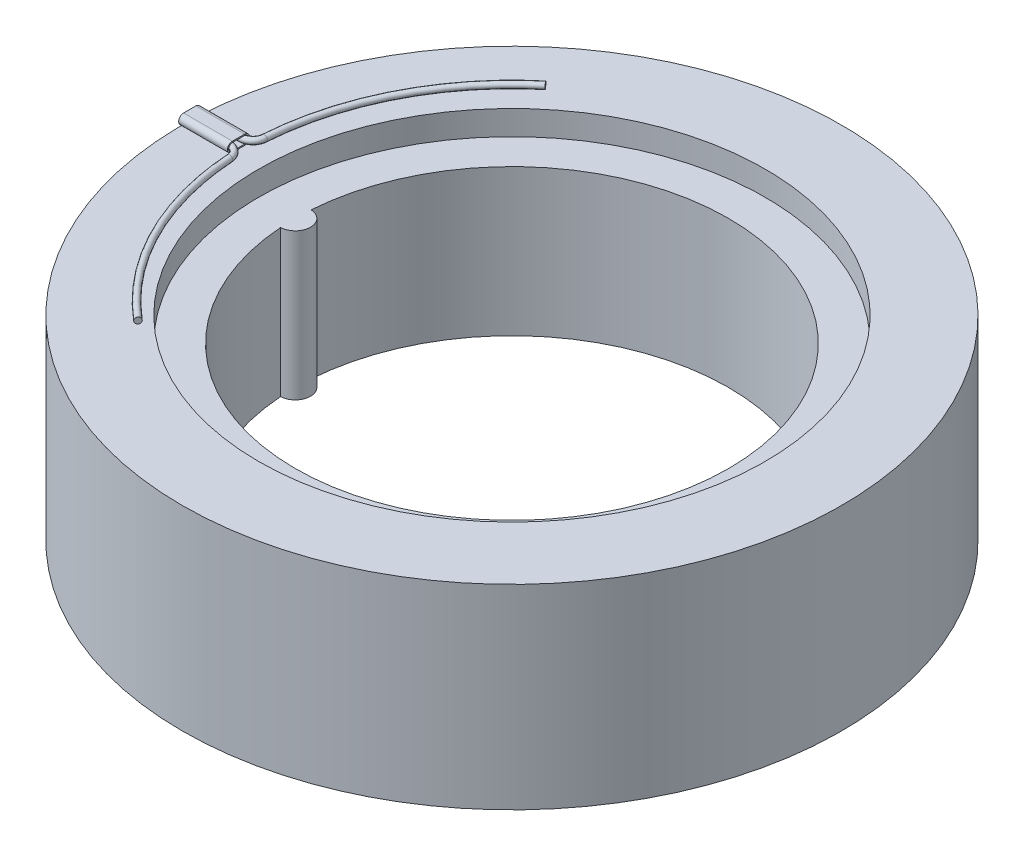
ISO-10303-21;
HEADER;
FILE_DESCRIPTION(('STEP AP214'),'2;1');
FILE_NAME('part.step','',(''),(''),'','','');
FILE_SCHEMA(('AUTOMOTIVE_DESIGN { 1 0 10303 214 1 1 1 1 }'));
ENDSEC;
DATA;
#1=APPLICATION_CONTEXT('core data for automotive mechanical design processes');
#2=APPLICATION_PROTOCOL_DEFINITION('international standard','automotive_design',2000,#1);
#3=PRODUCT_CONTEXT('',#1,'mechanical');
#4=PRODUCT('Part','Part','',(#3));
#5=PRODUCT_RELATED_PRODUCT_CATEGORY('part','',(#4));
#6=PRODUCT_DEFINITION_FORMATION('','',#4);
#7=PRODUCT_DEFINITION_CONTEXT('part definition',#1,'design');
#8=PRODUCT_DEFINITION('design','',#6,#7);
#9=PRODUCT_DEFINITION_SHAPE('','',#8);
#10=(LENGTH_UNIT() NAMED_UNIT(*) SI_UNIT(.MILLI.,.METRE.));
#11=(NAMED_UNIT(*) PLANE_ANGLE_UNIT() SI_UNIT($,.RADIAN.));
#12=(NAMED_UNIT(*) SI_UNIT($,.STERADIAN.) SOLID_ANGLE_UNIT());
#13=UNCERTAINTY_MEASURE_WITH_UNIT(LENGTH_MEASURE(1.E-05),#10,'distance_accuracy_value','');
#14=(GEOMETRIC_REPRESENTATION_CONTEXT(3) GLOBAL_UNCERTAINTY_ASSIGNED_CONTEXT((#13)) GLOBAL_UNIT_ASSIGNED_CONTEXT((#10,
#11,#12)) REPRESENTATION_CONTEXT('',''));
#15=CARTESIAN_POINT('',(0.,0.,0.));
#16=DIRECTION('',(0.,0.,1.));
#17=DIRECTION('',(1.,0.,0.));
#18=AXIS2_PLACEMENT_3D('',#15,#16,#17);
#19=CARTESIAN_POINT('',(-26.4,9.,-0.499999999999997));
#20=DIRECTION('',(1.,0.,0.));
#21=DIRECTION('',(0.,0.,-1.));
#22=AXIS2_PLACEMENT_3D('',#19,#20,#21);
#23=CYLINDRICAL_SURFACE('',#22,0.403274161944219);
#24=CARTESIAN_POINT('',(-22.4,9.,-0.499999999999997));
#25=DIRECTION('',(1.,0.,0.));
#26=DIRECTION('',(0.,0.,-1.));
#27=AXIS2_PLACEMENT_3D('',#24,#25,#26);
#28=CIRCLE('',#27,0.403274161944219);
#29=CARTESIAN_POINT('',(-22.4,8.59672583805578,-0.499999999999997));
#30=VERTEX_POINT('',#29);
#31=CARTESIAN_POINT('',(-22.4,9.40327416194422,-0.499999999999997));
#32=VERTEX_POINT('',#31);
#33=EDGE_CURVE('E180',#30,#32,#28,.T.);
#34=ORIENTED_EDGE('',*,*,#33,.F.);
#35=DIRECTION('',(1.,0.,0.));
#36=VECTOR('',#35,1.);
#37=CARTESIAN_POINT('',(-26.4,8.59672583805578,-0.499999999999997));
#38=LINE('',#37,#36);
#39=CARTESIAN_POINT('',(-26.4,8.59672583805578,-0.499999999999997));
#40=VERTEX_POINT('',#39);
#41=EDGE_CURVE('E13',#40,#30,#38,.T.);
#42=ORIENTED_EDGE('',*,*,#41,.F.);
#43=CARTESIAN_POINT('',(-26.4,9.,-0.499999999999997));
#44=DIRECTION('',(1.,0.,0.));
#45=DIRECTION('',(0.,0.,-1.));
#46=AXIS2_PLACEMENT_3D('',#43,#44,#45);
#47=CIRCLE('',#46,0.403274161944219);
#48=CARTESIAN_POINT('',(-26.4,9.40327416194422,-0.499999999999997));
#49=VERTEX_POINT('',#48);
#50=EDGE_CURVE('E184',#40,#49,#47,.T.);
#51=ORIENTED_EDGE('',*,*,#50,.T.);
#52=DIRECTION('',(1.,0.,0.));
#53=VECTOR('',#52,1.);
#54=CARTESIAN_POINT('',(-26.4,9.40327416194422,-0.499999999999997));
#55=LINE('',#54,#53);
#56=EDGE_CURVE('E85',#49,#32,#55,.T.);
#57=ORIENTED_EDGE('',*,*,#56,.T.);
#58=EDGE_LOOP('',(#34,#42,#51,#57));
#59=FACE_BOUND('',#58,.T.);
#60=ADVANCED_FACE('F82',(#59),#23,.T.);
#61=CARTESIAN_POINT('',(-26.4,8.59672583805578,-0.499999999999997));
#62=DIRECTION('',(0.,-1.,0.));
#63=DIRECTION('',(0.,0.,-1.));
#64=AXIS2_PLACEMENT_3D('',#61,#62,#63);
#65=PLANE('',#64);
#66=DIRECTION('',(0.,0.,-1.));
#67=VECTOR('',#66,1.);
#68=CARTESIAN_POINT('',(-22.4,8.59672583805578,-0.499999999999997));
#69=LINE('',#68,#67);
#70=CARTESIAN_POINT('',(-22.4,8.59672583805578,0.499999999999997));
#71=VERTEX_POINT('',#70);
#72=EDGE_CURVE('E188',#71,#30,#69,.T.);
#73=ORIENTED_EDGE('',*,*,#72,.F.);
#74=DIRECTION('',(1.,0.,0.));
#75=VECTOR('',#74,1.);
#76=CARTESIAN_POINT('',(-26.4,8.59672583805578,0.499999999999997));
#77=LINE('',#76,#75);
#78=CARTESIAN_POINT('',(-26.4,8.59672583805578,0.499999999999997));
#79=VERTEX_POINT('',#78);
#80=EDGE_CURVE('E90',#79,#71,#77,.T.);
#81=ORIENTED_EDGE('',*,*,#80,.F.);
#82=DIRECTION('',(0.,0.,-1.));
#83=VECTOR('',#82,1.);
#84=CARTESIAN_POINT('',(-26.4,8.59672583805578,-0.499999999999997));
#85=LINE('',#84,#83);
#86=EDGE_CURVE('E194',#79,#40,#85,.T.);
#87=ORIENTED_EDGE('',*,*,#86,.T.);
#88=ORIENTED_EDGE('',*,*,#41,.T.);
#89=EDGE_LOOP('',(#73,#81,#87,#88));
#90=FACE_BOUND('',#89,.T.);
#91=ADVANCED_FACE('F220',(#90),#65,.T.);
#92=CARTESIAN_POINT('',(-26.4,9.,0.499999999999997));
#93=DIRECTION('',(1.,0.,0.));
#94=DIRECTION('',(0.,0.,-1.));
#95=AXIS2_PLACEMENT_3D('',#92,#93,#94);
#96=CYLINDRICAL_SURFACE('',#95,0.403274161944219);
#97=CARTESIAN_POINT('',(-22.4,9.,0.499999999999997));
#98=DIRECTION('',(1.,0.,0.));
#99=DIRECTION('',(0.,0.,-1.));
#100=AXIS2_PLACEMENT_3D('',#97,#98,#99);
#101=CIRCLE('',#100,0.403274161944219);
#102=CARTESIAN_POINT('',(-22.4,9.40327416194422,0.499999999999997));
#103=VERTEX_POINT('',#102);
#104=EDGE_CURVE('E202',#103,#71,#101,.T.);
#105=ORIENTED_EDGE('',*,*,#104,.F.);
#106=DIRECTION('',(1.,0.,0.));
#107=VECTOR('',#106,1.);
#108=CARTESIAN_POINT('',(-26.4,9.40327416194422,0.499999999999997));
#109=LINE('',#108,#107);
#110=CARTESIAN_POINT('',(-26.4,9.40327416194422,0.499999999999997));
#111=VERTEX_POINT('',#110);
#112=EDGE_CURVE('E207',#111,#103,#109,.T.);
#113=ORIENTED_EDGE('',*,*,#112,.F.);
#114=CARTESIAN_POINT('',(-26.4,9.,0.499999999999997));
#115=DIRECTION('',(1.,0.,0.));
#116=DIRECTION('',(0.,0.,-1.));
#117=AXIS2_PLACEMENT_3D('',#114,#115,#116);
#118=CIRCLE('',#117,0.403274161944219);
#119=EDGE_CURVE('E191',#111,#79,#118,.T.);
#120=ORIENTED_EDGE('',*,*,#119,.T.);
#121=ORIENTED_EDGE('',*,*,#80,.T.);
#122=EDGE_LOOP('',(#105,#113,#120,#121));
#123=FACE_BOUND('',#122,.T.);
#124=ADVANCED_FACE('F224',(#123),#96,.T.);
#125=CARTESIAN_POINT('',(-26.4,9.40327416194422,-0.499999999999997));
#126=DIRECTION('',(0.,1.,0.));
#127=DIRECTION('',(0.,0.,1.));
#128=AXIS2_PLACEMENT_3D('',#125,#126,#127);
#129=PLANE('',#128);
#130=DIRECTION('',(0.,0.,1.));
#131=VECTOR('',#130,1.);
#132=CARTESIAN_POINT('',(-22.4,9.40327416194422,-0.499999999999997));
#133=LINE('',#132,#131);
#134=EDGE_CURVE('E199',#32,#103,#133,.T.);
#135=ORIENTED_EDGE('',*,*,#134,.F.);
#136=ORIENTED_EDGE('',*,*,#56,.F.);
#137=DIRECTION('',(0.,0.,1.));
#138=VECTOR('',#137,1.);
#139=CARTESIAN_POINT('',(-26.4,9.40327416194422,-0.499999999999997));
#140=LINE('',#139,#138);
#141=EDGE_CURVE('E187',#49,#111,#140,.T.);
#142=ORIENTED_EDGE('',*,*,#141,.T.);
#143=ORIENTED_EDGE('',*,*,#112,.T.);
#144=EDGE_LOOP('',(#135,#136,#142,#143));
#145=FACE_BOUND('',#144,.T.);
#146=ADVANCED_FACE('F215',(#145),#129,.T.);
#147=CARTESIAN_POINT('',(-26.4,9.,-0.499999999999997));
#148=DIRECTION('',(1.,0.,0.));
#149=DIRECTION('',(0.,0.,-1.));
#150=AXIS2_PLACEMENT_3D('',#147,#148,#149);
#151=PLANE('',#150);
#152=DIRECTION('',(0.,0.,-1.));
#153=VECTOR('',#152,1.);
#154=CARTESIAN_POINT('',(-26.4,8.69672583805578,-0.499999999999997));
#155=LINE('',#154,#153);
#156=CARTESIAN_POINT('',(-26.4,8.69672583805578,0.499999999999997));
#157=VERTEX_POINT('',#156);
#158=CARTESIAN_POINT('',(-26.4,8.69672583805578,-0.499999999999997));
#159=VERTEX_POINT('',#158);
#160=EDGE_CURVE('E155',#157,#159,#155,.T.);
#161=ORIENTED_EDGE('',*,*,#160,.T.);
#162=CARTESIAN_POINT('',(-26.4,9.,-0.499999999999997));
#163=DIRECTION('',(1.,0.,0.));
#164=DIRECTION('',(0.,0.,-1.));
#165=AXIS2_PLACEMENT_3D('',#162,#163,#164);
#166=CIRCLE('',#165,0.303274161944219);
#167=CARTESIAN_POINT('',(-26.4,9.30327416194422,-0.499999999999997));
#168=VERTEX_POINT('',#167);
#169=EDGE_CURVE('E149',#159,#168,#166,.T.);
#170=ORIENTED_EDGE('',*,*,#169,.T.);
#171=DIRECTION('',(0.,0.,1.));
#172=VECTOR('',#171,1.);
#173=CARTESIAN_POINT('',(-26.4,9.30327416194422,-0.499999999999997));
#174=LINE('',#173,#172);
#175=CARTESIAN_POINT('',(-26.4,9.30327416194422,0.499999999999997));
#176=VERTEX_POINT('',#175);
#177=EDGE_CURVE('E158',#168,#176,#174,.T.);
#178=ORIENTED_EDGE('',*,*,#177,.T.);
#179=CARTESIAN_POINT('',(-26.4,9.,0.499999999999997));
#180=DIRECTION('',(1.,0.,0.));
#181=DIRECTION('',(0.,0.,-1.));
#182=AXIS2_PLACEMENT_3D('',#179,#180,#181);
#183=CIRCLE('',#182,0.303274161944219);
#184=EDGE_CURVE('E98',#176,#157,#183,.T.);
#185=ORIENTED_EDGE('',*,*,#184,.T.);
#186=EDGE_LOOP('',(#161,#170,#178,#185));
#187=FACE_BOUND('',#186,.T.);
#188=ORIENTED_EDGE('',*,*,#50,.F.);
#189=ORIENTED_EDGE('',*,*,#86,.F.);
#190=ORIENTED_EDGE('',*,*,#119,.F.);
#191=ORIENTED_EDGE('',*,*,#141,.F.);
#192=EDGE_LOOP('',(#188,#189,#190,#191));
#193=FACE_BOUND('',#192,.T.);
#194=ADVANCED_FACE('F162',(#187,#193),#151,.F.);
#195=CARTESIAN_POINT('',(-22.4,9.,-0.499999999999997));
#196=DIRECTION('',(1.,0.,0.));
#197=DIRECTION('',(0.,0.,-1.));
#198=AXIS2_PLACEMENT_3D('',#195,#196,#197);
#199=PLANE('',#198);
#200=CARTESIAN_POINT('',(-22.4,9.,-0.499999999999997));
#201=DIRECTION('',(1.,0.,0.));
#202=DIRECTION('',(0.,0.,-1.));
#203=AXIS2_PLACEMENT_3D('',#200,#201,#202);
#204=CIRCLE('',#203,0.303274161944219);
#205=CARTESIAN_POINT('',(-22.4,8.69672583805578,-0.499999999999997));
#206=VERTEX_POINT('',#205);
#207=CARTESIAN_POINT('',(-22.4,9.30327416194422,-0.499999999999997));
#208=VERTEX_POINT('',#207);
#209=EDGE_CURVE('E106',#206,#208,#204,.T.);
#210=ORIENTED_EDGE('',*,*,#209,.F.);
#211=DIRECTION('',(0.,0.,-1.));
#212=VECTOR('',#211,1.);
#213=CARTESIAN_POINT('',(-22.4,8.69672583805578,-0.499999999999997));
#214=LINE('',#213,#212);
#215=CARTESIAN_POINT('',(-22.4,8.69672583805578,0.499999999999997));
#216=VERTEX_POINT('',#215);
#217=EDGE_CURVE('E165',#216,#206,#214,.T.);
#218=ORIENTED_EDGE('',*,*,#217,.F.);
#219=CARTESIAN_POINT('',(-22.4,9.,0.499999999999997));
#220=DIRECTION('',(1.,0.,0.));
#221=DIRECTION('',(0.,0.,-1.));
#222=AXIS2_PLACEMENT_3D('',#219,#220,#221);
#223=CIRCLE('',#222,0.303274161944219);
#224=CARTESIAN_POINT('',(-22.4,9.30327416194422,0.499999999999997));
#225=VERTEX_POINT('',#224);
#226=EDGE_CURVE('E168',#225,#216,#223,.T.);
#227=ORIENTED_EDGE('',*,*,#226,.F.);
#228=DIRECTION('',(0.,0.,1.));
#229=VECTOR('',#228,1.);
#230=CARTESIAN_POINT('',(-22.4,9.30327416194422,-0.499999999999997));
#231=LINE('',#230,#229);
#232=EDGE_CURVE('E174',#208,#225,#231,.T.);
#233=ORIENTED_EDGE('',*,*,#232,.F.);
#234=EDGE_LOOP('',(#210,#218,#227,#233));
#235=FACE_BOUND('',#234,.T.);
#236=ORIENTED_EDGE('',*,*,#33,.T.);
#237=ORIENTED_EDGE('',*,*,#134,.T.);
#238=ORIENTED_EDGE('',*,*,#104,.T.);
#239=ORIENTED_EDGE('',*,*,#72,.T.);
#240=EDGE_LOOP('',(#236,#237,#238,#239));
#241=FACE_BOUND('',#240,.T.);
#242=ADVANCED_FACE('F217',(#235,#241),#199,.T.);
#243=CARTESIAN_POINT('',(-26.4,9.,-0.499999999999997));
#244=DIRECTION('',(1.,0.,0.));
#245=DIRECTION('',(0.,0.,-1.));
#246=AXIS2_PLACEMENT_3D('',#243,#244,#245);
#247=CYLINDRICAL_SURFACE('',#246,0.303274161944219);
#248=ORIENTED_EDGE('',*,*,#209,.T.);
#249=DIRECTION('',(1.,0.,0.));
#250=VECTOR('',#249,1.);
#251=CARTESIAN_POINT('',(-26.4,9.30327416194422,-0.499999999999997));
#252=LINE('',#251,#250);
#253=EDGE_CURVE('E145',#168,#208,#252,.T.);
#254=ORIENTED_EDGE('',*,*,#253,.F.);
#255=ORIENTED_EDGE('',*,*,#169,.F.);
#256=DIRECTION('',(1.,0.,0.));
#257=VECTOR('',#256,1.);
#258=CARTESIAN_POINT('',(-26.4,8.69672583805578,-0.499999999999997));
#259=LINE('',#258,#257);
#260=EDGE_CURVE('E178',#159,#206,#259,.T.);
#261=ORIENTED_EDGE('',*,*,#260,.T.);
#262=EDGE_LOOP('',(#248,#254,#255,#261));
#263=FACE_BOUND('',#262,.T.);
#264=ADVANCED_FACE('F147',(#263),#247,.F.);
#265=CARTESIAN_POINT('',(-26.4,8.69672583805578,-0.499999999999997));
#266=DIRECTION('',(0.,-1.,0.));
#267=DIRECTION('',(0.,0.,-1.));
#268=AXIS2_PLACEMENT_3D('',#265,#266,#267);
#269=PLANE('',#268);
#270=ORIENTED_EDGE('',*,*,#217,.T.);
#271=ORIENTED_EDGE('',*,*,#260,.F.);
#272=ORIENTED_EDGE('',*,*,#160,.F.);
#273=DIRECTION('',(1.,0.,0.));
#274=VECTOR('',#273,1.);
#275=CARTESIAN_POINT('',(-26.4,8.69672583805578,0.499999999999997));
#276=LINE('',#275,#274);
#277=EDGE_CURVE('E181',#157,#216,#276,.T.);
#278=ORIENTED_EDGE('',*,*,#277,.T.);
#279=EDGE_LOOP('',(#270,#271,#272,#278));
#280=FACE_BOUND('',#279,.T.);
#281=ADVANCED_FACE('F275',(#280),#269,.F.);
#282=CARTESIAN_POINT('',(-26.4,9.,0.499999999999997));
#283=DIRECTION('',(1.,0.,0.));
#284=DIRECTION('',(0.,0.,-1.));
#285=AXIS2_PLACEMENT_3D('',#282,#283,#284);
#286=CYLINDRICAL_SURFACE('',#285,0.303274161944219);
#287=ORIENTED_EDGE('',*,*,#226,.T.);
#288=ORIENTED_EDGE('',*,*,#277,.F.);
#289=ORIENTED_EDGE('',*,*,#184,.F.);
#290=DIRECTION('',(1.,0.,0.));
#291=VECTOR('',#290,1.);
#292=CARTESIAN_POINT('',(-26.4,9.30327416194422,0.499999999999997));
#293=LINE('',#292,#291);
#294=EDGE_CURVE('E154',#176,#225,#293,.T.);
#295=ORIENTED_EDGE('',*,*,#294,.T.);
#296=EDGE_LOOP('',(#287,#288,#289,#295));
#297=FACE_BOUND('',#296,.T.);
#298=ADVANCED_FACE('F284',(#297),#286,.F.);
#299=CARTESIAN_POINT('',(-26.4,9.30327416194422,-0.499999999999997));
#300=DIRECTION('',(0.,1.,0.));
#301=DIRECTION('',(0.,0.,1.));
#302=AXIS2_PLACEMENT_3D('',#299,#300,#301);
#303=PLANE('',#302);
#304=ORIENTED_EDGE('',*,*,#232,.T.);
#305=ORIENTED_EDGE('',*,*,#294,.F.);
#306=ORIENTED_EDGE('',*,*,#177,.F.);
#307=ORIENTED_EDGE('',*,*,#253,.T.);
#308=EDGE_LOOP('',(#304,#305,#306,#307));
#309=FACE_BOUND('',#308,.T.);
#310=ADVANCED_FACE('F159',(#309),#303,.F.);
#311=CLOSED_SHELL('',(#60,#91,#124,#146,#194,#242,#264,#281,#298,#310));
#312=MANIFOLD_SOLID_BREP('B2',#311);
#313=CARTESIAN_POINT('',(-25.807382336069,9.,0.499999999999997));
#314=DIRECTION('',(-1.,0.,0.));
#315=DIRECTION('',(0.,0.,-1.));
#316=AXIS2_PLACEMENT_3D('',#313,#314,#315);
#317=PLANE('',#316);
#318=CARTESIAN_POINT('',(-25.807382336069,9.,0.499999999999997));
#319=DIRECTION('',(1.,0.,0.));
#320=DIRECTION('',(0.,0.,-1.));
#321=AXIS2_PLACEMENT_3D('',#318,#319,#320);
#322=CIRCLE('',#321,0.25);
#323=CARTESIAN_POINT('',(-25.807382336069,9.,0.249999999999997));
#324=VERTEX_POINT('',#323);
#325=EDGE_CURVE('E334',#324,#324,#322,.T.);
#326=ORIENTED_EDGE('',*,*,#325,.F.);
#327=EDGE_LOOP('',(#326));
#328=FACE_BOUND('',#327,.T.);
#329=ADVANCED_FACE('F322',(#328),#317,.T.);
#330=CARTESIAN_POINT('',(-13.9458880000921,9.,16.6905574469185));
#331=DIRECTION('',(-0.767381951582461,0.,-0.641190252877797));
#332=DIRECTION('',(0.641190252877797,0.,-0.767381951582461));
#333=AXIS2_PLACEMENT_3D('',#330,#331,#332);
#334=PLANE('',#333);
#335=CARTESIAN_POINT('',(-13.9458880000921,9.,16.6905574469185));
#336=DIRECTION('',(0.767381951582461,0.,0.641190252877797));
#337=DIRECTION('',(0.641190252877797,0.,-0.767381951582461));
#338=AXIS2_PLACEMENT_3D('',#335,#336,#337);
#339=CIRCLE('',#338,0.25);
#340=CARTESIAN_POINT('',(-13.7855904368726,9.,16.4987119590229));
#341=VERTEX_POINT('',#340);
#342=EDGE_CURVE('E80',#341,#341,#339,.T.);
#343=ORIENTED_EDGE('',*,*,#342,.T.);
#344=EDGE_LOOP('',(#343));
#345=FACE_BOUND('',#344,.T.);
#346=ADVANCED_FACE('F337',(#345),#334,.F.);
#347=CARTESIAN_POINT('',(-25.807382336069,9.,0.499999999999997));
#348=DIRECTION('',(1.,0.,0.));
#349=DIRECTION('',(0.,0.,1.));
#350=AXIS2_PLACEMENT_3D('',#347,#348,#349);
#351=CYLINDRICAL_SURFACE('',#350,0.25);
#352=CARTESIAN_POINT('',(-22.7004955893038,9.,0.499999999999997));
#353=DIRECTION('',(1.,0.,0.));
#354=DIRECTION('',(0.,0.,-1.));
#355=AXIS2_PLACEMENT_3D('',#352,#353,#354);
#356=CIRCLE('',#355,0.25);
#357=CARTESIAN_POINT('',(-22.7004955893038,9.,0.249999999999997));
#358=VERTEX_POINT('',#357);
#359=EDGE_CURVE('E347',#358,#358,#356,.T.);
#360=ORIENTED_EDGE('',*,*,#359,.F.);
#361=EDGE_LOOP('',(#360));
#362=FACE_BOUND('',#361,.T.);
#363=ORIENTED_EDGE('',*,*,#325,.T.);
#364=EDGE_LOOP('',(#363));
#365=FACE_BOUND('',#364,.T.);
#366=ADVANCED_FACE('F354',(#362,#365),#351,.T.);
#367=CARTESIAN_POINT('',(-22.7004955893038,9.,1.5));
#368=DIRECTION('',(0.,1.,0.));
#369=DIRECTION('',(0.,0.,-1.));
#370=AXIS2_PLACEMENT_3D('',#367,#368,#369);
#371=TOROIDAL_SURFACE('',#370,1.,0.25);
#372=CARTESIAN_POINT('',(-21.7026716073564,9.,1.43406593406593));
#373=DIRECTION('',(0.0659340659340658,0.,0.997823981947418));
#374=DIRECTION('',(0.997823981947419,0.,-0.0659340659340657));
#375=AXIS2_PLACEMENT_3D('',#372,#373,#374);
#376=CIRCLE('',#375,0.25);
#377=CARTESIAN_POINT('',(-21.4532156118695,9.,1.41758241758241));
#378=VERTEX_POINT('',#377);
#379=EDGE_CURVE('E329',#378,#378,#376,.T.);
#380=CARTESIAN_POINT('',(-22.7004955893038,9.,1.5));
#381=DIRECTION('',(0.,1.,0.));
#382=DIRECTION('',(0.,0.,-1.));
#383=AXIS2_PLACEMENT_3D('',#380,#381,#382);
#384=CIRCLE('',#383,1.25);
#385=EDGE_CURVE('',#378,#358,#384,.T.);
#386=ORIENTED_EDGE('',*,*,#379,.F.);
#387=ORIENTED_EDGE('',*,*,#359,.T.);
#388=ORIENTED_EDGE('',*,*,#385,.T.);
#389=ORIENTED_EDGE('',*,*,#385,.F.);
#390=EDGE_LOOP('',(#386,#388,#387,#389));
#391=FACE_BOUND('',#390,.T.);
#392=ADVANCED_FACE('F342',(#391),#371,.T.);
#393=CARTESIAN_POINT('',(0.,9.,0.));
#394=DIRECTION('',(0.,-1.,0.));
#395=DIRECTION('',(0.,0.,1.));
#396=AXIS2_PLACEMENT_3D('',#393,#394,#395);
#397=TOROIDAL_SURFACE('',#396,21.75,0.25);
#398=ORIENTED_EDGE('',*,*,#342,.F.);
#399=EDGE_LOOP('',(#398));
#400=FACE_BOUND('',#399,.T.);
#401=ORIENTED_EDGE('',*,*,#379,.T.);
#402=EDGE_LOOP('',(#401));
#403=FACE_BOUND('',#402,.T.);
#404=ADVANCED_FACE('F339',(#400,#403),#397,.T.);
#405=CLOSED_SHELL('',(#329,#346,#366,#392,#404));
#406=MANIFOLD_SOLID_BREP('B7',#405);
#407=CARTESIAN_POINT('',(-25.807382336069,9.,-0.499999999999997));
#408=DIRECTION('',(-1.,0.,0.));
#409=DIRECTION('',(0.,0.,1.));
#410=AXIS2_PLACEMENT_3D('',#407,#408,#409);
#411=PLANE('',#410);
#412=CARTESIAN_POINT('',(-25.807382336069,9.,-0.499999999999997));
#413=DIRECTION('',(-1.,0.,0.));
#414=DIRECTION('',(0.,0.,1.));
#415=AXIS2_PLACEMENT_3D('',#412,#413,#414);
#416=CIRCLE('',#415,0.25);
#417=CARTESIAN_POINT('',(-25.807382336069,9.,-0.249999999999997));
#418=VERTEX_POINT('',#417);
#419=EDGE_CURVE('E415',#418,#418,#416,.T.);
#420=ORIENTED_EDGE('',*,*,#419,.T.);
#421=EDGE_LOOP('',(#420));
#422=FACE_BOUND('',#421,.T.);
#423=ADVANCED_FACE('F403',(#422),#411,.T.);
#424=CARTESIAN_POINT('',(-13.9458880000921,9.,-16.6905574469185));
#425=DIRECTION('',(-0.767381951582461,0.,0.641190252877797));
#426=DIRECTION('',(0.641190252877797,0.,0.767381951582461));
#427=AXIS2_PLACEMENT_3D('',#424,#425,#426);
#428=PLANE('',#427);
#429=CARTESIAN_POINT('',(-13.9458880000921,9.,-16.6905574469185));
#430=DIRECTION('',(-0.767381951582461,0.,0.641190252877797));
#431=DIRECTION('',(0.641190252877797,0.,0.767381951582461));
#432=AXIS2_PLACEMENT_3D('',#429,#430,#431);
#433=CIRCLE('',#432,0.25);
#434=CARTESIAN_POINT('',(-13.7855904368726,9.,-16.4987119590229));
#435=VERTEX_POINT('',#434);
#436=EDGE_CURVE('E320',#435,#435,#433,.T.);
#437=ORIENTED_EDGE('',*,*,#436,.F.);
#438=EDGE_LOOP('',(#437));
#439=FACE_BOUND('',#438,.T.);
#440=ADVANCED_FACE('F421',(#439),#428,.F.);
#441=CARTESIAN_POINT('',(-25.807382336069,9.,-0.499999999999997));
#442=DIRECTION('',(1.,0.,0.));
#443=DIRECTION('',(0.,0.,-1.));
#444=AXIS2_PLACEMENT_3D('',#441,#442,#443);
#445=CYLINDRICAL_SURFACE('',#444,0.25);
#446=CARTESIAN_POINT('',(-22.7004955893038,9.,-0.499999999999997));
#447=DIRECTION('',(-1.,0.,0.));
#448=DIRECTION('',(0.,0.,1.));
#449=AXIS2_PLACEMENT_3D('',#446,#447,#448);
#450=CIRCLE('',#449,0.25);
#451=CARTESIAN_POINT('',(-22.7004955893038,9.,-0.249999999999997));
#452=VERTEX_POINT('',#451);
#453=EDGE_CURVE('E446',#452,#452,#450,.T.);
#454=ORIENTED_EDGE('',*,*,#453,.T.);
#455=EDGE_LOOP('',(#454));
#456=FACE_BOUND('',#455,.T.);
#457=ORIENTED_EDGE('',*,*,#419,.F.);
#458=EDGE_LOOP('',(#457));
#459=FACE_BOUND('',#458,.T.);
#460=ADVANCED_FACE('F423',(#456,#459),#445,.T.);
#461=CARTESIAN_POINT('',(-22.7004955893038,9.,-1.5));
#462=DIRECTION('',(0.,1.,0.));
#463=DIRECTION('',(0.,0.,1.));
#464=AXIS2_PLACEMENT_3D('',#461,#462,#463);
#465=TOROIDAL_SURFACE('',#464,1.,0.25);
#466=CARTESIAN_POINT('',(-21.7026716073564,9.,-1.43406593406593));
#467=DIRECTION('',(-0.0659340659340658,0.,0.997823981947418));
#468=DIRECTION('',(0.997823981947419,0.,0.0659340659340657));
#469=AXIS2_PLACEMENT_3D('',#466,#467,#468);
#470=CIRCLE('',#469,0.25);
#471=CARTESIAN_POINT('',(-21.4532156118695,9.,-1.41758241758241));
#472=VERTEX_POINT('',#471);
#473=EDGE_CURVE('E410',#472,#472,#470,.T.);
#474=CARTESIAN_POINT('',(-22.7004955893038,9.,-1.5));
#475=DIRECTION('',(0.,1.,0.));
#476=DIRECTION('',(0.,0.,1.));
#477=AXIS2_PLACEMENT_3D('',#474,#475,#476);
#478=CIRCLE('',#477,1.25);
#479=EDGE_CURVE('',#452,#472,#478,.T.);
#480=ORIENTED_EDGE('',*,*,#453,.F.);
#481=ORIENTED_EDGE('',*,*,#473,.T.);
#482=ORIENTED_EDGE('',*,*,#479,.T.);
#483=ORIENTED_EDGE('',*,*,#479,.F.);
#484=EDGE_LOOP('',(#480,#482,#481,#483));
#485=FACE_BOUND('',#484,.T.);
#486=ADVANCED_FACE('F428',(#485),#465,.T.);
#487=CARTESIAN_POINT('',(0.,9.,0.));
#488=DIRECTION('',(0.,-1.,0.));
#489=DIRECTION('',(0.,0.,-1.));
#490=AXIS2_PLACEMENT_3D('',#487,#488,#489);
#491=TOROIDAL_SURFACE('',#490,21.75,0.25);
#492=ORIENTED_EDGE('',*,*,#436,.T.);
#493=EDGE_LOOP('',(#492));
#494=FACE_BOUND('',#493,.T.);
#495=ORIENTED_EDGE('',*,*,#473,.F.);
#496=EDGE_LOOP('',(#495));
#497=FACE_BOUND('',#496,.T.);
#498=ADVANCED_FACE('F418',(#494,#497),#491,.T.);
#499=CLOSED_SHELL('',(#423,#440,#460,#486,#498));
#500=MANIFOLD_SOLID_BREP('B74',#499);
#501=CARTESIAN_POINT('',(0.,0.,0.));
#502=DIRECTION('',(0.,1.,0.));
#503=DIRECTION('',(0.,0.,1.));
#504=AXIS2_PLACEMENT_3D('',#501,#502,#503);
#505=CYLINDRICAL_SURFACE('',#504,20.75);
#506=CARTESIAN_POINT('',(0.,8.,0.));
#507=DIRECTION('',(0.,1.,0.));
#508=DIRECTION('',(0.,0.,1.));
#509=AXIS2_PLACEMENT_3D('',#506,#507,#508);
#510=CIRCLE('',#509,20.75);
#511=CARTESIAN_POINT('',(0.,8.,20.75));
#512=VERTEX_POINT('',#511);
#513=EDGE_CURVE('E500',#512,#512,#510,.T.);
#514=ORIENTED_EDGE('',*,*,#513,.T.);
#515=EDGE_LOOP('',(#514));
#516=FACE_BOUND('',#515,.T.);
#517=CARTESIAN_POINT('',(0.,-8.,0.));
#518=DIRECTION('',(0.,1.,0.));
#519=DIRECTION('',(0.,0.,1.));
#520=AXIS2_PLACEMENT_3D('',#517,#518,#519);
#521=CIRCLE('',#520,20.75);
#522=CARTESIAN_POINT('',(0.,-8.,20.75));
#523=VERTEX_POINT('',#522);
#524=EDGE_CURVE('E402',#523,#523,#521,.T.);
#525=ORIENTED_EDGE('',*,*,#524,.F.);
#526=EDGE_LOOP('',(#525));
#527=FACE_BOUND('',#526,.T.);
#528=ADVANCED_FACE('F485',(#516,#527),#505,.F.);
#529=CARTESIAN_POINT('',(-20.75,-8.,0.));
#530=DIRECTION('',(0.,-1.,0.));
#531=DIRECTION('',(0.,0.,-1.));
#532=AXIS2_PLACEMENT_3D('',#529,#530,#531);
#533=PLANE('',#532);
#534=ORIENTED_EDGE('',*,*,#524,.T.);
#535=EDGE_LOOP('',(#534));
#536=FACE_BOUND('',#535,.T.);
#537=CARTESIAN_POINT('',(0.,-8.,0.));
#538=DIRECTION('',(0.,1.,0.));
#539=DIRECTION('',(0.,0.,1.));
#540=AXIS2_PLACEMENT_3D('',#537,#538,#539);
#541=CIRCLE('',#540,27.);
#542=CARTESIAN_POINT('',(0.,-8.,27.));
#543=VERTEX_POINT('',#542);
#544=EDGE_CURVE('E491',#543,#543,#541,.T.);
#545=ORIENTED_EDGE('',*,*,#544,.F.);
#546=EDGE_LOOP('',(#545));
#547=FACE_BOUND('',#546,.T.);
#548=ADVANCED_FACE('F516',(#536,#547),#533,.T.);
#549=CARTESIAN_POINT('',(0.,0.,0.));
#550=DIRECTION('',(0.,1.,0.));
#551=DIRECTION('',(0.,0.,1.));
#552=AXIS2_PLACEMENT_3D('',#549,#550,#551);
#553=CYLINDRICAL_SURFACE('',#552,27.);
#554=ORIENTED_EDGE('',*,*,#544,.T.);
#555=EDGE_LOOP('',(#554));
#556=FACE_BOUND('',#555,.T.);
#557=CARTESIAN_POINT('',(0.,8.,0.));
#558=DIRECTION('',(0.,1.,0.));
#559=DIRECTION('',(0.,0.,1.));
#560=AXIS2_PLACEMENT_3D('',#557,#558,#559);
#561=CIRCLE('',#560,27.);
#562=CARTESIAN_POINT('',(0.,8.,27.));
#563=VERTEX_POINT('',#562);
#564=EDGE_CURVE('E495',#563,#563,#561,.T.);
#565=ORIENTED_EDGE('',*,*,#564,.F.);
#566=EDGE_LOOP('',(#565));
#567=FACE_BOUND('',#566,.T.);
#568=ADVANCED_FACE('F510',(#556,#567),#553,.T.);
#569=CARTESIAN_POINT('',(-20.75,8.,0.));
#570=DIRECTION('',(0.,1.,0.));
#571=DIRECTION('',(0.,0.,1.));
#572=AXIS2_PLACEMENT_3D('',#569,#570,#571);
#573=PLANE('',#572);
#574=ORIENTED_EDGE('',*,*,#564,.T.);
#575=EDGE_LOOP('',(#574));
#576=FACE_BOUND('',#575,.T.);
#577=ORIENTED_EDGE('',*,*,#513,.F.);
#578=EDGE_LOOP('',(#577));
#579=FACE_BOUND('',#578,.T.);
#580=ADVANCED_FACE('F508',(#576,#579),#573,.T.);
#581=CLOSED_SHELL('',(#528,#548,#568,#580));
#582=MANIFOLD_SOLID_BREP('B314',#581);
#583=CARTESIAN_POINT('',(0.,0.,0.));
#584=DIRECTION('',(0.,1.,0.));
#585=DIRECTION('',(0.,0.,1.));
#586=AXIS2_PLACEMENT_3D('',#583,#584,#585);
#587=CYLINDRICAL_SURFACE('',#586,17.75);
#588=CARTESIAN_POINT('',(0.,-6.,0.));
#589=DIRECTION('',(0.,1.,0.));
#590=DIRECTION('',(0.,0.,1.));
#591=AXIS2_PLACEMENT_3D('',#588,#589,#590);
#592=CIRCLE('',#591,17.75);
#593=CARTESIAN_POINT('',(-17.705985915493,-6.,1.24922486381156));
#594=VERTEX_POINT('',#593);
#595=CARTESIAN_POINT('',(-17.705985915493,-6.,-1.24922486381156));
#596=VERTEX_POINT('',#595);
#597=EDGE_CURVE('E588',#594,#596,#592,.T.);
#598=ORIENTED_EDGE('',*,*,#597,.F.);
#599=DIRECTION('',(0.,-1.,0.));
#600=VECTOR('',#599,1.);
#601=CARTESIAN_POINT('',(-17.705985915493,0.,1.24922486381156));
#602=LINE('',#601,#600);
#603=CARTESIAN_POINT('',(-17.705985915493,6.,1.24922486381156));
#604=VERTEX_POINT('',#603);
#605=EDGE_CURVE('E483',#594,#604,#602,.F.);
#606=ORIENTED_EDGE('',*,*,#605,.T.);
#607=CARTESIAN_POINT('',(0.,6.,0.));
#608=DIRECTION('',(0.,1.,0.));
#609=DIRECTION('',(0.,0.,1.));
#610=AXIS2_PLACEMENT_3D('',#607,#608,#609);
#611=CIRCLE('',#610,17.75);
#612=CARTESIAN_POINT('',(-17.705985915493,6.,-1.24922486381156));
#613=VERTEX_POINT('',#612);
#614=EDGE_CURVE('E590',#604,#613,#611,.T.);
#615=ORIENTED_EDGE('',*,*,#614,.T.);
#616=DIRECTION('',(0.,-1.,0.));
#617=VECTOR('',#616,1.);
#618=CARTESIAN_POINT('',(-17.705985915493,0.,-1.24922486381156));
#619=LINE('',#618,#617);
#620=EDGE_CURVE('E565',#613,#596,#619,.T.);
#621=ORIENTED_EDGE('',*,*,#620,.T.);
#622=EDGE_LOOP('',(#598,#606,#615,#621));
#623=FACE_BOUND('',#622,.T.);
#624=ADVANCED_FACE('F557',(#623),#587,.F.);
#625=CARTESIAN_POINT('',(-17.75,6.,0.));
#626=DIRECTION('',(0.,1.,0.));
#627=DIRECTION('',(0.,0.,1.));
#628=AXIS2_PLACEMENT_3D('',#625,#626,#627);
#629=PLANE('',#628);
#630=CARTESIAN_POINT('',(0.,6.,0.));
#631=DIRECTION('',(0.,1.,0.));
#632=DIRECTION('',(0.,0.,1.));
#633=AXIS2_PLACEMENT_3D('',#630,#631,#632);
#634=CIRCLE('',#633,20.75);
#635=CARTESIAN_POINT('',(0.,6.,20.75));
#636=VERTEX_POINT('',#635);
#637=EDGE_CURVE('E591',#636,#636,#634,.T.);
#638=ORIENTED_EDGE('',*,*,#637,.T.);
#639=EDGE_LOOP('',(#638));
#640=FACE_BOUND('',#639,.T.);
#641=ORIENTED_EDGE('',*,*,#614,.F.);
#642=CARTESIAN_POINT('',(-17.75,6.,0.));
#643=DIRECTION('',(0.,1.,0.));
#644=DIRECTION('',(0.,0.,1.));
#645=AXIS2_PLACEMENT_3D('',#642,#643,#644);
#646=CIRCLE('',#645,1.25);
#647=EDGE_CURVE('E584',#604,#613,#646,.T.);
#648=ORIENTED_EDGE('',*,*,#647,.T.);
#649=EDGE_LOOP('',(#641,#648));
#650=FACE_BOUND('',#649,.T.);
#651=ADVANCED_FACE('F559',(#640,#650),#629,.T.);
#652=CARTESIAN_POINT('',(0.,0.,0.));
#653=DIRECTION('',(0.,1.,0.));
#654=DIRECTION('',(0.,0.,1.));
#655=AXIS2_PLACEMENT_3D('',#652,#653,#654);
#656=CYLINDRICAL_SURFACE('',#655,20.75);
#657=CARTESIAN_POINT('',(0.,-6.,0.));
#658=DIRECTION('',(0.,1.,0.));
#659=DIRECTION('',(0.,0.,1.));
#660=AXIS2_PLACEMENT_3D('',#657,#658,#659);
#661=CIRCLE('',#660,20.75);
#662=CARTESIAN_POINT('',(0.,-6.,20.75));
#663=VERTEX_POINT('',#662);
#664=EDGE_CURVE('E594',#663,#663,#661,.T.);
#665=ORIENTED_EDGE('',*,*,#664,.T.);
#666=EDGE_LOOP('',(#665));
#667=FACE_BOUND('',#666,.T.);
#668=ORIENTED_EDGE('',*,*,#637,.F.);
#669=EDGE_LOOP('',(#668));
#670=FACE_BOUND('',#669,.T.);
#671=ADVANCED_FACE('F606',(#667,#670),#656,.T.);
#672=CARTESIAN_POINT('',(-20.75,-6.,0.));
#673=DIRECTION('',(0.,-1.,0.));
#674=DIRECTION('',(0.,0.,-1.));
#675=AXIS2_PLACEMENT_3D('',#672,#673,#674);
#676=PLANE('',#675);
#677=ORIENTED_EDGE('',*,*,#597,.T.);
#678=CARTESIAN_POINT('',(-17.75,-6.,0.));
#679=DIRECTION('',(0.,-1.,0.));
#680=DIRECTION('',(0.,0.,-1.));
#681=AXIS2_PLACEMENT_3D('',#678,#679,#680);
#682=CIRCLE('',#681,1.25);
#683=EDGE_CURVE('E571',#594,#596,#682,.F.);
#684=ORIENTED_EDGE('',*,*,#683,.F.);
#685=EDGE_LOOP('',(#677,#684));
#686=FACE_BOUND('',#685,.T.);
#687=ORIENTED_EDGE('',*,*,#664,.F.);
#688=EDGE_LOOP('',(#687));
#689=FACE_BOUND('',#688,.T.);
#690=ADVANCED_FACE('F592',(#686,#689),#676,.T.);
#691=CARTESIAN_POINT('',(-17.75,9.53553390593274,0.));
#692=DIRECTION('',(0.,-1.,0.));
#693=DIRECTION('',(0.,0.,-1.));
#694=AXIS2_PLACEMENT_3D('',#691,#692,#693);
#695=CYLINDRICAL_SURFACE('',#694,1.25);
#696=ORIENTED_EDGE('',*,*,#605,.F.);
#697=ORIENTED_EDGE('',*,*,#683,.T.);
#698=ORIENTED_EDGE('',*,*,#620,.F.);
#699=ORIENTED_EDGE('',*,*,#647,.F.);
#700=EDGE_LOOP('',(#696,#697,#698,#699));
#701=FACE_BOUND('',#700,.T.);
#702=ADVANCED_FACE('F582',(#701),#695,.T.);
#703=CLOSED_SHELL('',(#624,#651,#671,#690,#702));
#704=MANIFOLD_SOLID_BREP('B397',#703);
#705=ADVANCED_BREP_SHAPE_REPRESENTATION('',(#18,#312,#406,#500,#582,#704),#14);
#706=SHAPE_DEFINITION_REPRESENTATION(#9,#705);
ENDSEC;
END-ISO-10303-21;
